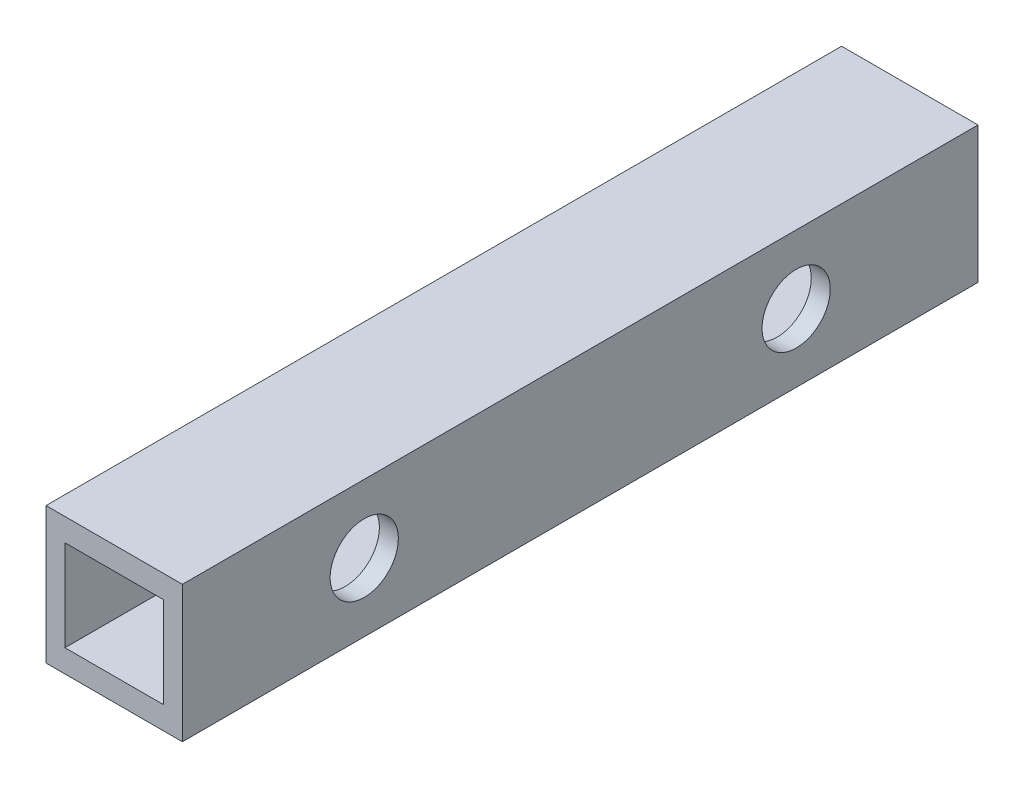
ISO-10303-21;
HEADER;
FILE_DESCRIPTION(('STEP AP214'),'2;1');
FILE_NAME('part.step','',(''),(''),'','','');
FILE_SCHEMA(('AUTOMOTIVE_DESIGN { 1 0 10303 214 1 1 1 1 }'));
ENDSEC;
DATA;
#1=APPLICATION_CONTEXT('core data for automotive mechanical design processes');
#2=APPLICATION_PROTOCOL_DEFINITION('international standard','automotive_design',2000,#1);
#3=PRODUCT_CONTEXT('',#1,'mechanical');
#4=PRODUCT('Part','Part','',(#3));
#5=PRODUCT_RELATED_PRODUCT_CATEGORY('part','',(#4));
#6=PRODUCT_DEFINITION_FORMATION('','',#4);
#7=PRODUCT_DEFINITION_CONTEXT('part definition',#1,'design');
#8=PRODUCT_DEFINITION('design','',#6,#7);
#9=PRODUCT_DEFINITION_SHAPE('','',#8);
#10=(LENGTH_UNIT() NAMED_UNIT(*) SI_UNIT(.MILLI.,.METRE.));
#11=(NAMED_UNIT(*) PLANE_ANGLE_UNIT() SI_UNIT($,.RADIAN.));
#12=(NAMED_UNIT(*) SI_UNIT($,.STERADIAN.) SOLID_ANGLE_UNIT());
#13=UNCERTAINTY_MEASURE_WITH_UNIT(LENGTH_MEASURE(1.E-05),#10,'distance_accuracy_value','');
#14=(GEOMETRIC_REPRESENTATION_CONTEXT(3) GLOBAL_UNCERTAINTY_ASSIGNED_CONTEXT((#13)) GLOBAL_UNIT_ASSIGNED_CONTEXT((#10,
#11,#12)) REPRESENTATION_CONTEXT('',''));
#15=CARTESIAN_POINT('',(0.,0.,0.));
#16=DIRECTION('',(0.,0.,1.));
#17=DIRECTION('',(1.,0.,0.));
#18=AXIS2_PLACEMENT_3D('',#15,#16,#17);
#19=CARTESIAN_POINT('',(30.,-30.,350.));
#20=DIRECTION('',(-1.,0.,0.));
#21=DIRECTION('',(0.,0.,1.));
#22=AXIS2_PLACEMENT_3D('',#19,#20,#21);
#23=PLANE('',#22);
#24=CARTESIAN_POINT('',(30.,0.,270.));
#25=DIRECTION('',(-1.,0.,0.));
#26=DIRECTION('',(0.,0.,1.));
#27=AXIS2_PLACEMENT_3D('',#24,#25,#26);
#28=CIRCLE('',#27,15.);
#29=CARTESIAN_POINT('',(30.,0.,255.));
#30=VERTEX_POINT('',#29);
#31=EDGE_CURVE('E246',#30,#30,#28,.T.);
#32=ORIENTED_EDGE('',*,*,#31,.T.);
#33=EDGE_LOOP('',(#32));
#34=FACE_BOUND('',#33,.T.);
#35=CARTESIAN_POINT('',(30.,0.,80.));
#36=DIRECTION('',(1.,0.,0.));
#37=DIRECTION('',(0.,0.,-1.));
#38=AXIS2_PLACEMENT_3D('',#35,#36,#37);
#39=CIRCLE('',#38,15.);
#40=CARTESIAN_POINT('',(30.,0.,65.));
#41=VERTEX_POINT('',#40);
#42=EDGE_CURVE('E194',#41,#41,#39,.T.);
#43=ORIENTED_EDGE('',*,*,#42,.F.);
#44=EDGE_LOOP('',(#43));
#45=FACE_BOUND('',#44,.T.);
#46=DIRECTION('',(0.,1.,0.));
#47=VECTOR('',#46,1.);
#48=CARTESIAN_POINT('',(30.,-30.,0.));
#49=LINE('',#48,#47);
#50=CARTESIAN_POINT('',(30.,-30.,0.));
#51=VERTEX_POINT('',#50);
#52=CARTESIAN_POINT('',(30.,30.,0.));
#53=VERTEX_POINT('',#52);
#54=EDGE_CURVE('E154',#51,#53,#49,.T.);
#55=ORIENTED_EDGE('',*,*,#54,.T.);
#56=DIRECTION('',(0.,0.,-1.));
#57=VECTOR('',#56,1.);
#58=CARTESIAN_POINT('',(30.,30.,350.));
#59=LINE('',#58,#57);
#60=CARTESIAN_POINT('',(30.,30.,350.));
#61=VERTEX_POINT('',#60);
#62=EDGE_CURVE('E11',#61,#53,#59,.T.);
#63=ORIENTED_EDGE('',*,*,#62,.F.);
#64=DIRECTION('',(0.,1.,0.));
#65=VECTOR('',#64,1.);
#66=CARTESIAN_POINT('',(30.,-30.,350.));
#67=LINE('',#66,#65);
#68=CARTESIAN_POINT('',(30.,-30.,350.));
#69=VERTEX_POINT('',#68);
#70=EDGE_CURVE('E155',#69,#61,#67,.T.);
#71=ORIENTED_EDGE('',*,*,#70,.F.);
#72=DIRECTION('',(0.,0.,-1.));
#73=VECTOR('',#72,1.);
#74=CARTESIAN_POINT('',(30.,-30.,350.));
#75=LINE('',#74,#73);
#76=EDGE_CURVE('E169',#69,#51,#75,.T.);
#77=ORIENTED_EDGE('',*,*,#76,.T.);
#78=EDGE_LOOP('',(#55,#63,#71,#77));
#79=FACE_BOUND('',#78,.T.);
#80=ADVANCED_FACE('F39',(#34,#45,#79),#23,.F.);
#81=CARTESIAN_POINT('',(-30.,30.,350.));
#82=DIRECTION('',(0.,-1.,0.));
#83=DIRECTION('',(0.,0.,-1.));
#84=AXIS2_PLACEMENT_3D('',#81,#82,#83);
#85=PLANE('',#84);
#86=DIRECTION('',(-1.,0.,0.));
#87=VECTOR('',#86,1.);
#88=CARTESIAN_POINT('',(-30.,30.,0.));
#89=LINE('',#88,#87);
#90=CARTESIAN_POINT('',(-30.,30.,0.));
#91=VERTEX_POINT('',#90);
#92=EDGE_CURVE('E173',#53,#91,#89,.T.);
#93=ORIENTED_EDGE('',*,*,#92,.T.);
#94=DIRECTION('',(0.,0.,-1.));
#95=VECTOR('',#94,1.);
#96=CARTESIAN_POINT('',(-30.,30.,350.));
#97=LINE('',#96,#95);
#98=CARTESIAN_POINT('',(-30.,30.,350.));
#99=VERTEX_POINT('',#98);
#100=EDGE_CURVE('E48',#99,#91,#97,.T.);
#101=ORIENTED_EDGE('',*,*,#100,.F.);
#102=DIRECTION('',(-1.,0.,0.));
#103=VECTOR('',#102,1.);
#104=CARTESIAN_POINT('',(-30.,30.,350.));
#105=LINE('',#104,#103);
#106=EDGE_CURVE('E159',#61,#99,#105,.T.);
#107=ORIENTED_EDGE('',*,*,#106,.F.);
#108=ORIENTED_EDGE('',*,*,#62,.T.);
#109=EDGE_LOOP('',(#93,#101,#107,#108));
#110=FACE_BOUND('',#109,.T.);
#111=ADVANCED_FACE('F237',(#110),#85,.F.);
#112=CARTESIAN_POINT('',(-30.,-30.,350.));
#113=DIRECTION('',(1.,0.,0.));
#114=DIRECTION('',(0.,0.,-1.));
#115=AXIS2_PLACEMENT_3D('',#112,#113,#114);
#116=PLANE('',#115);
#117=CARTESIAN_POINT('',(-30.,0.,270.));
#118=DIRECTION('',(1.,0.,0.));
#119=DIRECTION('',(0.,0.,-1.));
#120=AXIS2_PLACEMENT_3D('',#117,#118,#119);
#121=CIRCLE('',#120,15.);
#122=CARTESIAN_POINT('',(-30.,0.,255.));
#123=VERTEX_POINT('',#122);
#124=EDGE_CURVE('E203',#123,#123,#121,.F.);
#125=ORIENTED_EDGE('',*,*,#124,.F.);
#126=EDGE_LOOP('',(#125));
#127=FACE_BOUND('',#126,.T.);
#128=CARTESIAN_POINT('',(-30.,0.,80.));
#129=DIRECTION('',(1.,0.,0.));
#130=DIRECTION('',(0.,0.,-1.));
#131=AXIS2_PLACEMENT_3D('',#128,#129,#130);
#132=CIRCLE('',#131,15.);
#133=CARTESIAN_POINT('',(-30.,0.,65.));
#134=VERTEX_POINT('',#133);
#135=EDGE_CURVE('E200',#134,#134,#132,.T.);
#136=ORIENTED_EDGE('',*,*,#135,.T.);
#137=EDGE_LOOP('',(#136));
#138=FACE_BOUND('',#137,.T.);
#139=DIRECTION('',(0.,-1.,0.));
#140=VECTOR('',#139,1.);
#141=CARTESIAN_POINT('',(-30.,-30.,0.));
#142=LINE('',#141,#140);
#143=CARTESIAN_POINT('',(-30.,-30.,0.));
#144=VERTEX_POINT('',#143);
#145=EDGE_CURVE('E176',#91,#144,#142,.T.);
#146=ORIENTED_EDGE('',*,*,#145,.T.);
#147=DIRECTION('',(0.,0.,-1.));
#148=VECTOR('',#147,1.);
#149=CARTESIAN_POINT('',(-30.,-30.,350.));
#150=LINE('',#149,#148);
#151=CARTESIAN_POINT('',(-30.,-30.,350.));
#152=VERTEX_POINT('',#151);
#153=EDGE_CURVE('E184',#152,#144,#150,.T.);
#154=ORIENTED_EDGE('',*,*,#153,.F.);
#155=DIRECTION('',(0.,-1.,0.));
#156=VECTOR('',#155,1.);
#157=CARTESIAN_POINT('',(-30.,-30.,350.));
#158=LINE('',#157,#156);
#159=EDGE_CURVE('E163',#99,#152,#158,.T.);
#160=ORIENTED_EDGE('',*,*,#159,.F.);
#161=ORIENTED_EDGE('',*,*,#100,.T.);
#162=EDGE_LOOP('',(#146,#154,#160,#161));
#163=FACE_BOUND('',#162,.T.);
#164=ADVANCED_FACE('F218',(#127,#138,#163),#116,.F.);
#165=CARTESIAN_POINT('',(-30.,-30.,350.));
#166=DIRECTION('',(0.,1.,0.));
#167=DIRECTION('',(0.,0.,1.));
#168=AXIS2_PLACEMENT_3D('',#165,#166,#167);
#169=PLANE('',#168);
#170=DIRECTION('',(1.,0.,0.));
#171=VECTOR('',#170,1.);
#172=CARTESIAN_POINT('',(-30.,-30.,0.));
#173=LINE('',#172,#171);
#174=EDGE_CURVE('E160',#144,#51,#173,.T.);
#175=ORIENTED_EDGE('',*,*,#174,.T.);
#176=ORIENTED_EDGE('',*,*,#76,.F.);
#177=DIRECTION('',(1.,0.,0.));
#178=VECTOR('',#177,1.);
#179=CARTESIAN_POINT('',(-30.,-30.,350.));
#180=LINE('',#179,#178);
#181=EDGE_CURVE('E166',#152,#69,#180,.T.);
#182=ORIENTED_EDGE('',*,*,#181,.F.);
#183=ORIENTED_EDGE('',*,*,#153,.T.);
#184=EDGE_LOOP('',(#175,#176,#182,#183));
#185=FACE_BOUND('',#184,.T.);
#186=ADVANCED_FACE('F261',(#185),#169,.F.);
#187=CARTESIAN_POINT('',(0.,0.,350.));
#188=DIRECTION('',(0.,0.,-1.));
#189=DIRECTION('',(-1.,0.,0.));
#190=AXIS2_PLACEMENT_3D('',#187,#188,#189);
#191=PLANE('',#190);
#192=DIRECTION('',(-1.,0.,0.));
#193=VECTOR('',#192,1.);
#194=CARTESIAN_POINT('',(0.,-20.,350.));
#195=LINE('',#194,#193);
#196=CARTESIAN_POINT('',(21.6561873125665,-20.,350.));
#197=VERTEX_POINT('',#196);
#198=CARTESIAN_POINT('',(-21.6561873125665,-20.,350.));
#199=VERTEX_POINT('',#198);
#200=EDGE_CURVE('E146',#197,#199,#195,.T.);
#201=ORIENTED_EDGE('',*,*,#200,.T.);
#202=DIRECTION('',(0.,1.,0.));
#203=VECTOR('',#202,1.);
#204=CARTESIAN_POINT('',(-21.6561873125665,0.,350.));
#205=LINE('',#204,#203);
#206=CARTESIAN_POINT('',(-21.6561873125665,20.,350.));
#207=VERTEX_POINT('',#206);
#208=EDGE_CURVE('E150',#199,#207,#205,.T.);
#209=ORIENTED_EDGE('',*,*,#208,.T.);
#210=DIRECTION('',(1.,0.,0.));
#211=VECTOR('',#210,1.);
#212=CARTESIAN_POINT('',(0.,20.,350.));
#213=LINE('',#212,#211);
#214=CARTESIAN_POINT('',(21.6561873125665,20.,350.));
#215=VERTEX_POINT('',#214);
#216=EDGE_CURVE('E137',#207,#215,#213,.T.);
#217=ORIENTED_EDGE('',*,*,#216,.T.);
#218=DIRECTION('',(0.,-1.,0.));
#219=VECTOR('',#218,1.);
#220=CARTESIAN_POINT('',(21.6561873125665,0.,350.));
#221=LINE('',#220,#219);
#222=EDGE_CURVE('E112',#215,#197,#221,.T.);
#223=ORIENTED_EDGE('',*,*,#222,.T.);
#224=EDGE_LOOP('',(#201,#209,#217,#223));
#225=FACE_BOUND('',#224,.T.);
#226=ORIENTED_EDGE('',*,*,#70,.T.);
#227=ORIENTED_EDGE('',*,*,#106,.T.);
#228=ORIENTED_EDGE('',*,*,#159,.T.);
#229=ORIENTED_EDGE('',*,*,#181,.T.);
#230=EDGE_LOOP('',(#226,#227,#228,#229));
#231=FACE_BOUND('',#230,.T.);
#232=ADVANCED_FACE('F257',(#225,#231),#191,.F.);
#233=CARTESIAN_POINT('',(0.,0.,0.));
#234=DIRECTION('',(0.,0.,-1.));
#235=DIRECTION('',(-1.,0.,0.));
#236=AXIS2_PLACEMENT_3D('',#233,#234,#235);
#237=PLANE('',#236);
#238=DIRECTION('',(0.,1.,0.));
#239=VECTOR('',#238,1.);
#240=CARTESIAN_POINT('',(-21.6561873125665,-20.,0.));
#241=LINE('',#240,#239);
#242=CARTESIAN_POINT('',(-21.6561873125665,-20.,0.));
#243=VERTEX_POINT('',#242);
#244=CARTESIAN_POINT('',(-21.6561873125665,20.,0.));
#245=VERTEX_POINT('',#244);
#246=EDGE_CURVE('E64',#243,#245,#241,.T.);
#247=ORIENTED_EDGE('',*,*,#246,.F.);
#248=DIRECTION('',(-1.,0.,0.));
#249=VECTOR('',#248,1.);
#250=CARTESIAN_POINT('',(21.6561873125665,-20.,0.));
#251=LINE('',#250,#249);
#252=CARTESIAN_POINT('',(21.6561873125665,-20.,0.));
#253=VERTEX_POINT('',#252);
#254=EDGE_CURVE('E127',#253,#243,#251,.T.);
#255=ORIENTED_EDGE('',*,*,#254,.F.);
#256=DIRECTION('',(0.,-1.,0.));
#257=VECTOR('',#256,1.);
#258=CARTESIAN_POINT('',(21.6561873125665,-20.,0.));
#259=LINE('',#258,#257);
#260=CARTESIAN_POINT('',(21.6561873125665,20.,0.));
#261=VERTEX_POINT('',#260);
#262=EDGE_CURVE('E109',#261,#253,#259,.T.);
#263=ORIENTED_EDGE('',*,*,#262,.F.);
#264=DIRECTION('',(1.,0.,0.));
#265=VECTOR('',#264,1.);
#266=CARTESIAN_POINT('',(21.6561873125665,20.,0.));
#267=LINE('',#266,#265);
#268=EDGE_CURVE('E119',#245,#261,#267,.T.);
#269=ORIENTED_EDGE('',*,*,#268,.F.);
#270=EDGE_LOOP('',(#247,#255,#263,#269));
#271=FACE_BOUND('',#270,.T.);
#272=ORIENTED_EDGE('',*,*,#54,.F.);
#273=ORIENTED_EDGE('',*,*,#174,.F.);
#274=ORIENTED_EDGE('',*,*,#145,.F.);
#275=ORIENTED_EDGE('',*,*,#92,.F.);
#276=EDGE_LOOP('',(#272,#273,#274,#275));
#277=FACE_BOUND('',#276,.T.);
#278=ADVANCED_FACE('F124',(#271,#277),#237,.T.);
#279=CARTESIAN_POINT('',(-21.6561873125665,-20.,375.));
#280=DIRECTION('',(-1.,0.,0.));
#281=DIRECTION('',(0.,0.,1.));
#282=AXIS2_PLACEMENT_3D('',#279,#280,#281);
#283=PLANE('',#282);
#284=CARTESIAN_POINT('',(-21.6561873125666,0.,270.));
#285=DIRECTION('',(-1.,0.,0.));
#286=DIRECTION('',(0.,0.,1.));
#287=AXIS2_PLACEMENT_3D('',#284,#285,#286);
#288=CIRCLE('',#287,15.);
#289=CARTESIAN_POINT('',(-21.6561873125666,0.,255.));
#290=VERTEX_POINT('',#289);
#291=EDGE_CURVE('E209',#290,#290,#288,.F.);
#292=ORIENTED_EDGE('',*,*,#291,.F.);
#293=EDGE_LOOP('',(#292));
#294=FACE_BOUND('',#293,.T.);
#295=CARTESIAN_POINT('',(-21.6561873125666,0.,80.));
#296=DIRECTION('',(-1.,0.,0.));
#297=DIRECTION('',(0.,0.,1.));
#298=AXIS2_PLACEMENT_3D('',#295,#296,#297);
#299=CIRCLE('',#298,15.);
#300=CARTESIAN_POINT('',(-21.6561873125666,0.,65.));
#301=VERTEX_POINT('',#300);
#302=EDGE_CURVE('E193',#301,#301,#299,.T.);
#303=ORIENTED_EDGE('',*,*,#302,.T.);
#304=EDGE_LOOP('',(#303));
#305=FACE_BOUND('',#304,.T.);
#306=DIRECTION('',(0.,0.,-1.));
#307=VECTOR('',#306,1.);
#308=CARTESIAN_POINT('',(-21.6561873125665,-20.,375.));
#309=LINE('',#308,#307);
#310=EDGE_CURVE('E134',#199,#243,#309,.T.);
#311=ORIENTED_EDGE('',*,*,#310,.T.);
#312=ORIENTED_EDGE('',*,*,#246,.T.);
#313=DIRECTION('',(0.,0.,-1.));
#314=VECTOR('',#313,1.);
#315=CARTESIAN_POINT('',(-21.6561873125665,20.,375.));
#316=LINE('',#315,#314);
#317=EDGE_CURVE('E116',#207,#245,#316,.T.);
#318=ORIENTED_EDGE('',*,*,#317,.F.);
#319=ORIENTED_EDGE('',*,*,#208,.F.);
#320=EDGE_LOOP('',(#311,#312,#318,#319));
#321=FACE_BOUND('',#320,.T.);
#322=ADVANCED_FACE('F273',(#294,#305,#321),#283,.F.);
#323=CARTESIAN_POINT('',(21.6561873125665,-20.,375.));
#324=DIRECTION('',(0.,-1.,0.));
#325=DIRECTION('',(0.,0.,-1.));
#326=AXIS2_PLACEMENT_3D('',#323,#324,#325);
#327=PLANE('',#326);
#328=DIRECTION('',(0.,0.,-1.));
#329=VECTOR('',#328,1.);
#330=CARTESIAN_POINT('',(21.6561873125665,-20.,375.));
#331=LINE('',#330,#329);
#332=EDGE_CURVE('E115',#197,#253,#331,.T.);
#333=ORIENTED_EDGE('',*,*,#332,.T.);
#334=ORIENTED_EDGE('',*,*,#254,.T.);
#335=ORIENTED_EDGE('',*,*,#310,.F.);
#336=ORIENTED_EDGE('',*,*,#200,.F.);
#337=EDGE_LOOP('',(#333,#334,#335,#336));
#338=FACE_BOUND('',#337,.T.);
#339=ADVANCED_FACE('F279',(#338),#327,.F.);
#340=CARTESIAN_POINT('',(21.6561873125665,-20.,375.));
#341=DIRECTION('',(1.,0.,0.));
#342=DIRECTION('',(0.,0.,-1.));
#343=AXIS2_PLACEMENT_3D('',#340,#341,#342);
#344=PLANE('',#343);
#345=CARTESIAN_POINT('',(21.6561873125665,0.,270.));
#346=DIRECTION('',(1.,0.,0.));
#347=DIRECTION('',(0.,0.,-1.));
#348=AXIS2_PLACEMENT_3D('',#345,#346,#347);
#349=CIRCLE('',#348,15.);
#350=CARTESIAN_POINT('',(21.6561873125665,0.,255.));
#351=VERTEX_POINT('',#350);
#352=EDGE_CURVE('E42',#351,#351,#349,.F.);
#353=ORIENTED_EDGE('',*,*,#352,.F.);
#354=EDGE_LOOP('',(#353));
#355=FACE_BOUND('',#354,.T.);
#356=CARTESIAN_POINT('',(21.6561873125665,0.,80.));
#357=DIRECTION('',(1.,0.,0.));
#358=DIRECTION('',(0.,0.,-1.));
#359=AXIS2_PLACEMENT_3D('',#356,#357,#358);
#360=CIRCLE('',#359,15.);
#361=CARTESIAN_POINT('',(21.6561873125665,0.,65.));
#362=VERTEX_POINT('',#361);
#363=EDGE_CURVE('E190',#362,#362,#360,.T.);
#364=ORIENTED_EDGE('',*,*,#363,.T.);
#365=EDGE_LOOP('',(#364));
#366=FACE_BOUND('',#365,.T.);
#367=DIRECTION('',(0.,0.,-1.));
#368=VECTOR('',#367,1.);
#369=CARTESIAN_POINT('',(21.6561873125665,20.,375.));
#370=LINE('',#369,#368);
#371=EDGE_CURVE('E56',#215,#261,#370,.T.);
#372=ORIENTED_EDGE('',*,*,#371,.T.);
#373=ORIENTED_EDGE('',*,*,#262,.T.);
#374=ORIENTED_EDGE('',*,*,#332,.F.);
#375=ORIENTED_EDGE('',*,*,#222,.F.);
#376=EDGE_LOOP('',(#372,#373,#374,#375));
#377=FACE_BOUND('',#376,.T.);
#378=ADVANCED_FACE('F106',(#355,#366,#377),#344,.F.);
#379=CARTESIAN_POINT('',(21.6561873125665,20.,375.));
#380=DIRECTION('',(0.,1.,0.));
#381=DIRECTION('',(0.,0.,1.));
#382=AXIS2_PLACEMENT_3D('',#379,#380,#381);
#383=PLANE('',#382);
#384=ORIENTED_EDGE('',*,*,#317,.T.);
#385=ORIENTED_EDGE('',*,*,#268,.T.);
#386=ORIENTED_EDGE('',*,*,#371,.F.);
#387=ORIENTED_EDGE('',*,*,#216,.F.);
#388=EDGE_LOOP('',(#384,#385,#386,#387));
#389=FACE_BOUND('',#388,.T.);
#390=ADVANCED_FACE('F120',(#389),#383,.F.);
#391=CARTESIAN_POINT('',(-345.,0.,80.));
#392=DIRECTION('',(1.,0.,0.));
#393=DIRECTION('',(0.,0.,-1.));
#394=AXIS2_PLACEMENT_3D('',#391,#392,#393);
#395=CYLINDRICAL_SURFACE('',#394,15.);
#396=CARTESIAN_POINT('',(30.,0.,65.));
#397=CARTESIAN_POINT('',(29.9130852845059,0.,65.));
#398=CARTESIAN_POINT('',(29.8261705690118,0.,65.));
#399=CARTESIAN_POINT('',(29.6523411380236,0.,65.));
#400=CARTESIAN_POINT('',(29.5654264225295,0.,65.));
#401=CARTESIAN_POINT('',(29.3915969915413,0.,65.));
#402=CARTESIAN_POINT('',(29.3046822760472,0.,65.));
#403=CARTESIAN_POINT('',(29.130852845059,0.,65.));
#404=CARTESIAN_POINT('',(29.0439381295649,0.,65.));
#405=CARTESIAN_POINT('',(28.8701086985767,0.,65.));
#406=CARTESIAN_POINT('',(28.7831939830826,0.,65.));
#407=CARTESIAN_POINT('',(28.6093645520945,0.,65.));
#408=CARTESIAN_POINT('',(28.5224498366004,0.,65.));
#409=CARTESIAN_POINT('',(28.3486204056121,0.,65.));
#410=CARTESIAN_POINT('',(28.261705690118,0.,65.));
#411=CARTESIAN_POINT('',(28.0878762591298,0.,65.));
#412=CARTESIAN_POINT('',(28.0009615436357,0.,65.));
#413=CARTESIAN_POINT('',(27.8271321126475,0.,65.));
#414=CARTESIAN_POINT('',(27.7402173971534,0.,65.));
#415=CARTESIAN_POINT('',(27.5663879661652,0.,65.));
#416=CARTESIAN_POINT('',(27.4794732506711,0.,65.));
#417=CARTESIAN_POINT('',(27.3056438196829,0.,65.));
#418=CARTESIAN_POINT('',(27.2187291041888,0.,65.));
#419=CARTESIAN_POINT('',(27.0448996732006,0.,65.));
#420=CARTESIAN_POINT('',(26.9579849577066,0.,65.));
#421=CARTESIAN_POINT('',(26.7841555267184,0.,65.));
#422=CARTESIAN_POINT('',(26.6972408112243,0.,65.));
#423=CARTESIAN_POINT('',(26.5234113802361,0.,65.));
#424=CARTESIAN_POINT('',(26.436496664742,0.,65.));
#425=CARTESIAN_POINT('',(26.2626672337538,0.,65.));
#426=CARTESIAN_POINT('',(26.1757525182597,0.,65.));
#427=CARTESIAN_POINT('',(26.0019230872715,0.,65.));
#428=CARTESIAN_POINT('',(25.9150083717773,0.,65.));
#429=CARTESIAN_POINT('',(25.7411789407891,0.,65.));
#430=CARTESIAN_POINT('',(25.654264225295,0.,65.));
#431=CARTESIAN_POINT('',(25.4804347943068,0.,65.));
#432=CARTESIAN_POINT('',(25.3935200788127,0.,65.));
#433=CARTESIAN_POINT('',(25.2196906478245,0.,65.));
#434=CARTESIAN_POINT('',(25.1327759323304,0.,65.));
#435=CARTESIAN_POINT('',(24.9589465013422,0.,65.));
#436=CARTESIAN_POINT('',(24.8720317858481,0.,65.));
#437=CARTESIAN_POINT('',(24.6982023548599,0.,65.));
#438=CARTESIAN_POINT('',(24.6112876393659,0.,65.));
#439=CARTESIAN_POINT('',(24.4374582083777,0.,65.));
#440=CARTESIAN_POINT('',(24.3505434928836,0.,65.));
#441=CARTESIAN_POINT('',(24.1767140618954,0.,65.));
#442=CARTESIAN_POINT('',(24.0897993464013,0.,65.));
#443=CARTESIAN_POINT('',(23.9159699154131,0.,65.));
#444=CARTESIAN_POINT('',(23.829055199919,0.,65.));
#445=CARTESIAN_POINT('',(23.6552257689308,0.,65.));
#446=CARTESIAN_POINT('',(23.5683110534367,0.,65.));
#447=CARTESIAN_POINT('',(23.3944816224484,0.,65.));
#448=CARTESIAN_POINT('',(23.3075669069543,0.,65.));
#449=CARTESIAN_POINT('',(23.1337374759661,0.,65.));
#450=CARTESIAN_POINT('',(23.046822760472,0.,65.));
#451=CARTESIAN_POINT('',(22.8729933294839,0.,65.));
#452=CARTESIAN_POINT('',(22.7860786139898,0.,65.));
#453=CARTESIAN_POINT('',(22.6122491830016,0.,65.));
#454=CARTESIAN_POINT('',(22.5253344675075,0.,65.));
#455=CARTESIAN_POINT('',(22.3515050365193,0.,65.));
#456=CARTESIAN_POINT('',(22.2645903210252,0.,65.));
#457=CARTESIAN_POINT('',(22.090760890037,0.,65.));
#458=CARTESIAN_POINT('',(22.0038461745429,0.,65.));
#459=CARTESIAN_POINT('',(21.8300167435547,0.,65.));
#460=CARTESIAN_POINT('',(21.7431020280606,0.,65.));
#461=CARTESIAN_POINT('',(21.6561873125665,0.,65.));
#462=B_SPLINE_CURVE_WITH_KNOTS('',3,(#396,#397,#398,#399,#400,#401,#402,#403,#404,#405,#406,
#407,#408,#409,#410,#411,#412,#413,#414,#415,#416,#417,#418,#419,#420,#421,#422,#423,#424,#425,
#426,#427,#428,#429,#430,#431,#432,#433,#434,#435,#436,#437,#438,#439,#440,#441,#442,#443,#444,
#445,#446,#447,#448,#449,#450,#451,#452,#453,#454,#455,#456,#457,#458,#459,#460,#461),
.UNSPECIFIED.,.F.,.F.,(4,2,2,2,2,2,2,2,2,2,2,2,2,2,2,2,2,2,2,2,2,2,2,2,2,2,2,2,2,2,2,2,4),(0.,
0.260744146482306,0.521488292964611,0.782232439446917,1.04297658592922,1.30372073241147,
1.56446487889378,1.82520902537608,2.08595317185839,2.3466973183407,2.607441464823,
2.86818561130531,3.12892975778756,3.38967390426986,3.65041805075217,3.91116219723447,
4.17190634371678,4.43265049019909,4.69339463668139,4.9541387831637,5.214882929646,
5.47562707612825,5.73637122261056,5.99711536909286,6.25785951557517,6.51860366205748,
6.77934780853978,7.04009195502209,7.30083610150434,7.56158024798664,7.82232439446895,
8.08306854095125,8.34381268743356),.UNSPECIFIED.);
#463=EDGE_CURVE('BSEAM224',#41,#362,#462,.T.);
#464=ORIENTED_EDGE('',*,*,#42,.T.);
#465=ORIENTED_EDGE('',*,*,#363,.F.);
#466=ORIENTED_EDGE('',*,*,#463,.T.);
#467=ORIENTED_EDGE('',*,*,#463,.F.);
#468=EDGE_LOOP('',(#464,#466,#465,#467));
#469=FACE_BOUND('',#468,.T.);
#470=ADVANCED_FACE('F224',(#469),#395,.F.);
#471=CARTESIAN_POINT('',(-21.6561873125666,0.,65.));
#472=CARTESIAN_POINT('',(-21.7431020280607,0.,65.));
#473=CARTESIAN_POINT('',(-21.8300167435548,0.,65.));
#474=CARTESIAN_POINT('',(-22.003846174543,0.,65.));
#475=CARTESIAN_POINT('',(-22.0907608900371,0.,65.));
#476=CARTESIAN_POINT('',(-22.2645903210253,0.,65.));
#477=CARTESIAN_POINT('',(-22.3515050365194,0.,65.));
#478=CARTESIAN_POINT('',(-22.5253344675075,0.,65.));
#479=CARTESIAN_POINT('',(-22.6122491830016,0.,65.));
#480=CARTESIAN_POINT('',(-22.7860786139898,0.,65.));
#481=CARTESIAN_POINT('',(-22.8729933294839,0.,65.));
#482=CARTESIAN_POINT('',(-23.0468227604722,0.,65.));
#483=CARTESIAN_POINT('',(-23.1337374759663,0.,65.));
#484=CARTESIAN_POINT('',(-23.3075669069545,0.,65.));
#485=CARTESIAN_POINT('',(-23.3944816224486,0.,65.));
#486=CARTESIAN_POINT('',(-23.5683110534367,0.,65.));
#487=CARTESIAN_POINT('',(-23.6552257689308,0.,65.));
#488=CARTESIAN_POINT('',(-23.829055199919,0.,65.));
#489=CARTESIAN_POINT('',(-23.9159699154131,0.,65.));
#490=CARTESIAN_POINT('',(-24.0897993464013,0.,65.));
#491=CARTESIAN_POINT('',(-24.1767140618954,0.,65.));
#492=CARTESIAN_POINT('',(-24.3505434928836,0.,65.));
#493=CARTESIAN_POINT('',(-24.4374582083777,0.,65.));
#494=CARTESIAN_POINT('',(-24.6112876393659,0.,65.));
#495=CARTESIAN_POINT('',(-24.69820235486,0.,65.));
#496=CARTESIAN_POINT('',(-24.8720317858482,0.,65.));
#497=CARTESIAN_POINT('',(-24.9589465013423,0.,65.));
#498=CARTESIAN_POINT('',(-25.1327759323305,0.,65.));
#499=CARTESIAN_POINT('',(-25.2196906478246,0.,65.));
#500=CARTESIAN_POINT('',(-25.3935200788128,0.,65.));
#501=CARTESIAN_POINT('',(-25.4804347943069,0.,65.));
#502=CARTESIAN_POINT('',(-25.6542642252951,0.,65.));
#503=CARTESIAN_POINT('',(-25.7411789407892,0.,65.));
#504=CARTESIAN_POINT('',(-25.9150083717774,0.,65.));
#505=CARTESIAN_POINT('',(-26.0019230872715,0.,65.));
#506=CARTESIAN_POINT('',(-26.1757525182597,0.,65.));
#507=CARTESIAN_POINT('',(-26.2626672337538,0.,65.));
#508=CARTESIAN_POINT('',(-26.436496664742,0.,65.));
#509=CARTESIAN_POINT('',(-26.5234113802361,0.,65.));
#510=CARTESIAN_POINT('',(-26.6972408112243,0.,65.));
#511=CARTESIAN_POINT('',(-26.7841555267184,0.,65.));
#512=CARTESIAN_POINT('',(-26.9579849577066,0.,65.));
#513=CARTESIAN_POINT('',(-27.0448996732007,0.,65.));
#514=CARTESIAN_POINT('',(-27.2187291041889,0.,65.));
#515=CARTESIAN_POINT('',(-27.305643819683,0.,65.));
#516=CARTESIAN_POINT('',(-27.4794732506712,0.,65.));
#517=CARTESIAN_POINT('',(-27.5663879661653,0.,65.));
#518=CARTESIAN_POINT('',(-27.7402173971535,0.,65.));
#519=CARTESIAN_POINT('',(-27.8271321126476,0.,65.));
#520=CARTESIAN_POINT('',(-28.0009615436358,0.,65.));
#521=CARTESIAN_POINT('',(-28.0878762591299,0.,65.));
#522=CARTESIAN_POINT('',(-28.261705690118,0.,65.));
#523=CARTESIAN_POINT('',(-28.3486204056121,0.,65.));
#524=CARTESIAN_POINT('',(-28.5224498366004,0.,65.));
#525=CARTESIAN_POINT('',(-28.6093645520945,0.,65.));
#526=CARTESIAN_POINT('',(-28.7831939830827,0.,65.));
#527=CARTESIAN_POINT('',(-28.8701086985768,0.,65.));
#528=CARTESIAN_POINT('',(-29.043938129565,0.,65.));
#529=CARTESIAN_POINT('',(-29.1308528450591,0.,65.));
#530=CARTESIAN_POINT('',(-29.3046822760472,0.,65.));
#531=CARTESIAN_POINT('',(-29.3915969915413,0.,65.));
#532=CARTESIAN_POINT('',(-29.5654264225295,0.,65.));
#533=CARTESIAN_POINT('',(-29.6523411380236,0.,65.));
#534=CARTESIAN_POINT('',(-29.8261705690118,0.,65.));
#535=CARTESIAN_POINT('',(-29.9130852845059,0.,65.));
#536=CARTESIAN_POINT('',(-30.,0.,65.));
#537=B_SPLINE_CURVE_WITH_KNOTS('',3,(#471,#472,#473,#474,#475,#476,#477,#478,#479,#480,#481,
#482,#483,#484,#485,#486,#487,#488,#489,#490,#491,#492,#493,#494,#495,#496,#497,#498,#499,#500,
#501,#502,#503,#504,#505,#506,#507,#508,#509,#510,#511,#512,#513,#514,#515,#516,#517,#518,#519,
#520,#521,#522,#523,#524,#525,#526,#527,#528,#529,#530,#531,#532,#533,#534,#535,#536),
.UNSPECIFIED.,.F.,.F.,(4,2,2,2,2,2,2,2,2,2,2,2,2,2,2,2,2,2,2,2,2,2,2,2,2,2,2,2,2,2,2,2,4),(0.,
0.260744146482306,0.521488292964611,0.782232439446862,1.04297658592917,1.30372073241147,
1.56446487889378,1.82520902537608,2.08595317185833,2.34669731834064,2.60744146482295,
2.86818561130525,3.12892975778756,3.38967390426986,3.65041805075211,3.91116219723442,
4.17190634371672,4.43265049019903,4.69339463668134,4.95413878316359,5.21488292964589,
5.4756270761282,5.7363712226105,5.99711536909281,6.25785951557511,6.51860366205737,
6.77934780853967,7.04009195502198,7.30083610150428,7.56158024798659,7.82232439446884,
8.08306854095114,8.34381268743345),.UNSPECIFIED.);
#538=EDGE_CURVE('BSEAM221',#301,#134,#537,.T.);
#539=ORIENTED_EDGE('',*,*,#302,.F.);
#540=ORIENTED_EDGE('',*,*,#135,.F.);
#541=ORIENTED_EDGE('',*,*,#538,.T.);
#542=ORIENTED_EDGE('',*,*,#538,.F.);
#543=EDGE_LOOP('',(#539,#541,#540,#542));
#544=FACE_BOUND('',#543,.T.);
#545=ADVANCED_FACE('F221',(#544),#395,.F.);
#546=CARTESIAN_POINT('',(-345.,0.,270.));
#547=DIRECTION('',(1.,0.,0.));
#548=DIRECTION('',(0.,0.,-1.));
#549=AXIS2_PLACEMENT_3D('',#546,#547,#548);
#550=CYLINDRICAL_SURFACE('',#549,15.);
#551=CARTESIAN_POINT('',(30.,0.,255.));
#552=CARTESIAN_POINT('',(29.9130852845059,0.,255.));
#553=CARTESIAN_POINT('',(29.8261705690118,0.,255.));
#554=CARTESIAN_POINT('',(29.6523411380236,0.,255.));
#555=CARTESIAN_POINT('',(29.5654264225295,0.,255.));
#556=CARTESIAN_POINT('',(29.3915969915413,0.,255.));
#557=CARTESIAN_POINT('',(29.3046822760472,0.,255.));
#558=CARTESIAN_POINT('',(29.130852845059,0.,255.));
#559=CARTESIAN_POINT('',(29.0439381295649,0.,255.));
#560=CARTESIAN_POINT('',(28.8701086985767,0.,255.));
#561=CARTESIAN_POINT('',(28.7831939830826,0.,255.));
#562=CARTESIAN_POINT('',(28.6093645520945,0.,255.));
#563=CARTESIAN_POINT('',(28.5224498366004,0.,255.));
#564=CARTESIAN_POINT('',(28.3486204056121,0.,255.));
#565=CARTESIAN_POINT('',(28.261705690118,0.,255.));
#566=CARTESIAN_POINT('',(28.0878762591298,0.,255.));
#567=CARTESIAN_POINT('',(28.0009615436357,0.,255.));
#568=CARTESIAN_POINT('',(27.8271321126475,0.,255.));
#569=CARTESIAN_POINT('',(27.7402173971534,0.,255.));
#570=CARTESIAN_POINT('',(27.5663879661652,0.,255.));
#571=CARTESIAN_POINT('',(27.4794732506711,0.,255.));
#572=CARTESIAN_POINT('',(27.3056438196829,0.,255.));
#573=CARTESIAN_POINT('',(27.2187291041888,0.,255.));
#574=CARTESIAN_POINT('',(27.0448996732006,0.,255.));
#575=CARTESIAN_POINT('',(26.9579849577066,0.,255.));
#576=CARTESIAN_POINT('',(26.7841555267184,0.,255.));
#577=CARTESIAN_POINT('',(26.6972408112243,0.,255.));
#578=CARTESIAN_POINT('',(26.5234113802361,0.,255.));
#579=CARTESIAN_POINT('',(26.436496664742,0.,255.));
#580=CARTESIAN_POINT('',(26.2626672337538,0.,255.));
#581=CARTESIAN_POINT('',(26.1757525182597,0.,255.));
#582=CARTESIAN_POINT('',(26.0019230872715,0.,255.));
#583=CARTESIAN_POINT('',(25.9150083717773,0.,255.));
#584=CARTESIAN_POINT('',(25.7411789407891,0.,255.));
#585=CARTESIAN_POINT('',(25.654264225295,0.,255.));
#586=CARTESIAN_POINT('',(25.4804347943068,0.,255.));
#587=CARTESIAN_POINT('',(25.3935200788127,0.,255.));
#588=CARTESIAN_POINT('',(25.2196906478245,0.,255.));
#589=CARTESIAN_POINT('',(25.1327759323304,0.,255.));
#590=CARTESIAN_POINT('',(24.9589465013422,0.,255.));
#591=CARTESIAN_POINT('',(24.8720317858481,0.,255.));
#592=CARTESIAN_POINT('',(24.6982023548599,0.,255.));
#593=CARTESIAN_POINT('',(24.6112876393659,0.,255.));
#594=CARTESIAN_POINT('',(24.4374582083777,0.,255.));
#595=CARTESIAN_POINT('',(24.3505434928836,0.,255.));
#596=CARTESIAN_POINT('',(24.1767140618954,0.,255.));
#597=CARTESIAN_POINT('',(24.0897993464013,0.,255.));
#598=CARTESIAN_POINT('',(23.9159699154131,0.,255.));
#599=CARTESIAN_POINT('',(23.829055199919,0.,255.));
#600=CARTESIAN_POINT('',(23.6552257689308,0.,255.));
#601=CARTESIAN_POINT('',(23.5683110534367,0.,255.));
#602=CARTESIAN_POINT('',(23.3944816224484,0.,255.));
#603=CARTESIAN_POINT('',(23.3075669069543,0.,255.));
#604=CARTESIAN_POINT('',(23.1337374759661,0.,255.));
#605=CARTESIAN_POINT('',(23.046822760472,0.,255.));
#606=CARTESIAN_POINT('',(22.8729933294839,0.,255.));
#607=CARTESIAN_POINT('',(22.7860786139898,0.,255.));
#608=CARTESIAN_POINT('',(22.6122491830016,0.,255.));
#609=CARTESIAN_POINT('',(22.5253344675075,0.,255.));
#610=CARTESIAN_POINT('',(22.3515050365193,0.,255.));
#611=CARTESIAN_POINT('',(22.2645903210252,0.,255.));
#612=CARTESIAN_POINT('',(22.090760890037,0.,255.));
#613=CARTESIAN_POINT('',(22.0038461745429,0.,255.));
#614=CARTESIAN_POINT('',(21.8300167435547,0.,255.));
#615=CARTESIAN_POINT('',(21.7431020280606,0.,255.));
#616=CARTESIAN_POINT('',(21.6561873125665,0.,255.));
#617=B_SPLINE_CURVE_WITH_KNOTS('',3,(#551,#552,#553,#554,#555,#556,#557,#558,#559,#560,#561,
#562,#563,#564,#565,#566,#567,#568,#569,#570,#571,#572,#573,#574,#575,#576,#577,#578,#579,#580,
#581,#582,#583,#584,#585,#586,#587,#588,#589,#590,#591,#592,#593,#594,#595,#596,#597,#598,#599,
#600,#601,#602,#603,#604,#605,#606,#607,#608,#609,#610,#611,#612,#613,#614,#615,#616),
.UNSPECIFIED.,.F.,.F.,(4,2,2,2,2,2,2,2,2,2,2,2,2,2,2,2,2,2,2,2,2,2,2,2,2,2,2,2,2,2,2,2,4),(0.,
0.260744146482306,0.521488292964611,0.782232439446917,1.04297658592922,1.30372073241147,
1.56446487889378,1.82520902537608,2.08595317185839,2.3466973183407,2.607441464823,
2.86818561130531,3.12892975778756,3.38967390426986,3.65041805075217,3.91116219723447,
4.17190634371678,4.43265049019909,4.69339463668139,4.9541387831637,5.214882929646,
5.47562707612825,5.73637122261056,5.99711536909286,6.25785951557517,6.51860366205748,
6.77934780853978,7.04009195502209,7.30083610150434,7.56158024798664,7.82232439446895,
8.08306854095125,8.34381268743356),.UNSPECIFIED.);
#618=EDGE_CURVE('BSEAM223',#30,#351,#617,.T.);
#619=ORIENTED_EDGE('',*,*,#31,.F.);
#620=ORIENTED_EDGE('',*,*,#352,.T.);
#621=ORIENTED_EDGE('',*,*,#618,.T.);
#622=ORIENTED_EDGE('',*,*,#618,.F.);
#623=EDGE_LOOP('',(#619,#621,#620,#622));
#624=FACE_BOUND('',#623,.T.);
#625=ADVANCED_FACE('F223',(#624),#550,.F.);
#626=CARTESIAN_POINT('',(-21.6561873125666,0.,255.));
#627=CARTESIAN_POINT('',(-21.7431020280607,0.,255.));
#628=CARTESIAN_POINT('',(-21.8300167435548,0.,255.));
#629=CARTESIAN_POINT('',(-22.003846174543,0.,255.));
#630=CARTESIAN_POINT('',(-22.0907608900371,0.,255.));
#631=CARTESIAN_POINT('',(-22.2645903210253,0.,255.));
#632=CARTESIAN_POINT('',(-22.3515050365194,0.,255.));
#633=CARTESIAN_POINT('',(-22.5253344675075,0.,255.));
#634=CARTESIAN_POINT('',(-22.6122491830016,0.,255.));
#635=CARTESIAN_POINT('',(-22.7860786139898,0.,255.));
#636=CARTESIAN_POINT('',(-22.8729933294839,0.,255.));
#637=CARTESIAN_POINT('',(-23.0468227604722,0.,255.));
#638=CARTESIAN_POINT('',(-23.1337374759663,0.,255.));
#639=CARTESIAN_POINT('',(-23.3075669069545,0.,255.));
#640=CARTESIAN_POINT('',(-23.3944816224486,0.,255.));
#641=CARTESIAN_POINT('',(-23.5683110534367,0.,255.));
#642=CARTESIAN_POINT('',(-23.6552257689308,0.,255.));
#643=CARTESIAN_POINT('',(-23.829055199919,0.,255.));
#644=CARTESIAN_POINT('',(-23.9159699154131,0.,255.));
#645=CARTESIAN_POINT('',(-24.0897993464013,0.,255.));
#646=CARTESIAN_POINT('',(-24.1767140618954,0.,255.));
#647=CARTESIAN_POINT('',(-24.3505434928836,0.,255.));
#648=CARTESIAN_POINT('',(-24.4374582083777,0.,255.));
#649=CARTESIAN_POINT('',(-24.6112876393659,0.,255.));
#650=CARTESIAN_POINT('',(-24.69820235486,0.,255.));
#651=CARTESIAN_POINT('',(-24.8720317858482,0.,255.));
#652=CARTESIAN_POINT('',(-24.9589465013423,0.,255.));
#653=CARTESIAN_POINT('',(-25.1327759323305,0.,255.));
#654=CARTESIAN_POINT('',(-25.2196906478246,0.,255.));
#655=CARTESIAN_POINT('',(-25.3935200788128,0.,255.));
#656=CARTESIAN_POINT('',(-25.4804347943069,0.,255.));
#657=CARTESIAN_POINT('',(-25.6542642252951,0.,255.));
#658=CARTESIAN_POINT('',(-25.7411789407892,0.,255.));
#659=CARTESIAN_POINT('',(-25.9150083717774,0.,255.));
#660=CARTESIAN_POINT('',(-26.0019230872715,0.,255.));
#661=CARTESIAN_POINT('',(-26.1757525182597,0.,255.));
#662=CARTESIAN_POINT('',(-26.2626672337538,0.,255.));
#663=CARTESIAN_POINT('',(-26.436496664742,0.,255.));
#664=CARTESIAN_POINT('',(-26.5234113802361,0.,255.));
#665=CARTESIAN_POINT('',(-26.6972408112243,0.,255.));
#666=CARTESIAN_POINT('',(-26.7841555267184,0.,255.));
#667=CARTESIAN_POINT('',(-26.9579849577066,0.,255.));
#668=CARTESIAN_POINT('',(-27.0448996732007,0.,255.));
#669=CARTESIAN_POINT('',(-27.2187291041889,0.,255.));
#670=CARTESIAN_POINT('',(-27.305643819683,0.,255.));
#671=CARTESIAN_POINT('',(-27.4794732506712,0.,255.));
#672=CARTESIAN_POINT('',(-27.5663879661653,0.,255.));
#673=CARTESIAN_POINT('',(-27.7402173971535,0.,255.));
#674=CARTESIAN_POINT('',(-27.8271321126476,0.,255.));
#675=CARTESIAN_POINT('',(-28.0009615436358,0.,255.));
#676=CARTESIAN_POINT('',(-28.0878762591299,0.,255.));
#677=CARTESIAN_POINT('',(-28.261705690118,0.,255.));
#678=CARTESIAN_POINT('',(-28.3486204056121,0.,255.));
#679=CARTESIAN_POINT('',(-28.5224498366004,0.,255.));
#680=CARTESIAN_POINT('',(-28.6093645520945,0.,255.));
#681=CARTESIAN_POINT('',(-28.7831939830827,0.,255.));
#682=CARTESIAN_POINT('',(-28.8701086985768,0.,255.));
#683=CARTESIAN_POINT('',(-29.043938129565,0.,255.));
#684=CARTESIAN_POINT('',(-29.1308528450591,0.,255.));
#685=CARTESIAN_POINT('',(-29.3046822760472,0.,255.));
#686=CARTESIAN_POINT('',(-29.3915969915413,0.,255.));
#687=CARTESIAN_POINT('',(-29.5654264225295,0.,255.));
#688=CARTESIAN_POINT('',(-29.6523411380236,0.,255.));
#689=CARTESIAN_POINT('',(-29.8261705690118,0.,255.));
#690=CARTESIAN_POINT('',(-29.9130852845059,0.,255.));
#691=CARTESIAN_POINT('',(-30.,0.,255.));
#692=B_SPLINE_CURVE_WITH_KNOTS('',3,(#626,#627,#628,#629,#630,#631,#632,#633,#634,#635,#636,
#637,#638,#639,#640,#641,#642,#643,#644,#645,#646,#647,#648,#649,#650,#651,#652,#653,#654,#655,
#656,#657,#658,#659,#660,#661,#662,#663,#664,#665,#666,#667,#668,#669,#670,#671,#672,#673,#674,
#675,#676,#677,#678,#679,#680,#681,#682,#683,#684,#685,#686,#687,#688,#689,#690,#691),
.UNSPECIFIED.,.F.,.F.,(4,2,2,2,2,2,2,2,2,2,2,2,2,2,2,2,2,2,2,2,2,2,2,2,2,2,2,2,2,2,2,2,4),(0.,
0.260744146482306,0.521488292964611,0.782232439446862,1.04297658592917,1.30372073241147,
1.56446487889378,1.82520902537608,2.08595317185833,2.34669731834064,2.60744146482295,
2.86818561130525,3.12892975778756,3.38967390426986,3.65041805075211,3.91116219723442,
4.17190634371672,4.43265049019903,4.69339463668134,4.95413878316359,5.21488292964589,
5.4756270761282,5.7363712226105,5.99711536909281,6.25785951557511,6.51860366205737,
6.77934780853967,7.04009195502198,7.30083610150428,7.56158024798659,7.82232439446884,
8.08306854095114,8.34381268743345),.UNSPECIFIED.);
#693=EDGE_CURVE('BSEAM231',#290,#123,#692,.T.);
#694=ORIENTED_EDGE('',*,*,#291,.T.);
#695=ORIENTED_EDGE('',*,*,#124,.T.);
#696=ORIENTED_EDGE('',*,*,#693,.T.);
#697=ORIENTED_EDGE('',*,*,#693,.F.);
#698=EDGE_LOOP('',(#694,#696,#695,#697));
#699=FACE_BOUND('',#698,.T.);
#700=ADVANCED_FACE('F231',(#699),#550,.F.);
#701=CLOSED_SHELL('',(#80,#111,#164,#186,#232,#278,#322,#339,#378,#390,#470,#545,#625,#700));
#702=MANIFOLD_SOLID_BREP('B2',#701);
#703=ADVANCED_BREP_SHAPE_REPRESENTATION('',(#18,#702),#14);
#704=SHAPE_DEFINITION_REPRESENTATION(#9,#703);
ENDSEC;
END-ISO-10303-21;
